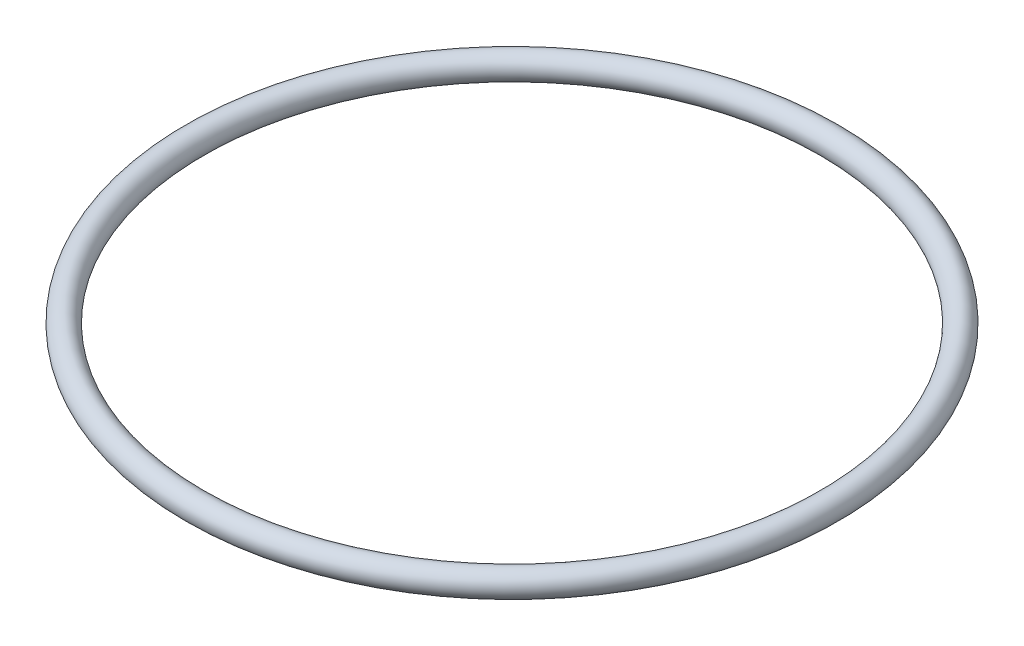
ISO-10303-21;
HEADER;
FILE_DESCRIPTION(('STEP AP214'),'2;1');
FILE_NAME('part.step','',(''),(''),'','','');
FILE_SCHEMA(('AUTOMOTIVE_DESIGN { 1 0 10303 214 1 1 1 1 }'));
ENDSEC;
DATA;
#1=APPLICATION_CONTEXT('core data for automotive mechanical design processes');
#2=APPLICATION_PROTOCOL_DEFINITION('international standard','automotive_design',2000,#1);
#3=PRODUCT_CONTEXT('',#1,'mechanical');
#4=PRODUCT('Part','Part','',(#3));
#5=PRODUCT_RELATED_PRODUCT_CATEGORY('part','',(#4));
#6=PRODUCT_DEFINITION_FORMATION('','',#4);
#7=PRODUCT_DEFINITION_CONTEXT('part definition',#1,'design');
#8=PRODUCT_DEFINITION('design','',#6,#7);
#9=PRODUCT_DEFINITION_SHAPE('','',#8);
#10=(LENGTH_UNIT() NAMED_UNIT(*) SI_UNIT(.MILLI.,.METRE.));
#11=(NAMED_UNIT(*) PLANE_ANGLE_UNIT() SI_UNIT($,.RADIAN.));
#12=(NAMED_UNIT(*) SI_UNIT($,.STERADIAN.) SOLID_ANGLE_UNIT());
#13=UNCERTAINTY_MEASURE_WITH_UNIT(LENGTH_MEASURE(1.E-05),#10,'distance_accuracy_value','');
#14=(GEOMETRIC_REPRESENTATION_CONTEXT(3) GLOBAL_UNCERTAINTY_ASSIGNED_CONTEXT((#13)) GLOBAL_UNIT_ASSIGNED_CONTEXT((#10,
#11,#12)) REPRESENTATION_CONTEXT('',''));
#15=CARTESIAN_POINT('',(0.,0.,0.));
#16=DIRECTION('',(0.,0.,1.));
#17=DIRECTION('',(1.,0.,0.));
#18=AXIS2_PLACEMENT_3D('',#15,#16,#17);
#19=CARTESIAN_POINT('',(0.,18.67,0.));
#20=DIRECTION('',(0.,-1.,0.));
#21=DIRECTION('',(0.,0.,-1.));
#22=AXIS2_PLACEMENT_3D('',#19,#20,#21);
#23=TOROIDAL_SURFACE('',#22,67.365,2.665);
#24=CARTESIAN_POINT('',(0.,18.67,-70.03));
#25=VERTEX_POINT('',#24);
#26=VERTEX_LOOP('',#25);
#27=FACE_BOUND('',#26,.T.);
#28=ADVANCED_FACE('F12',(#27),#23,.T.);
#29=CLOSED_SHELL('',(#28));
#30=MANIFOLD_SOLID_BREP('B1',#29);
#31=ADVANCED_BREP_SHAPE_REPRESENTATION('',(#18,#30),#14);
#32=SHAPE_DEFINITION_REPRESENTATION(#9,#31);
ENDSEC;
END-ISO-10303-21;
